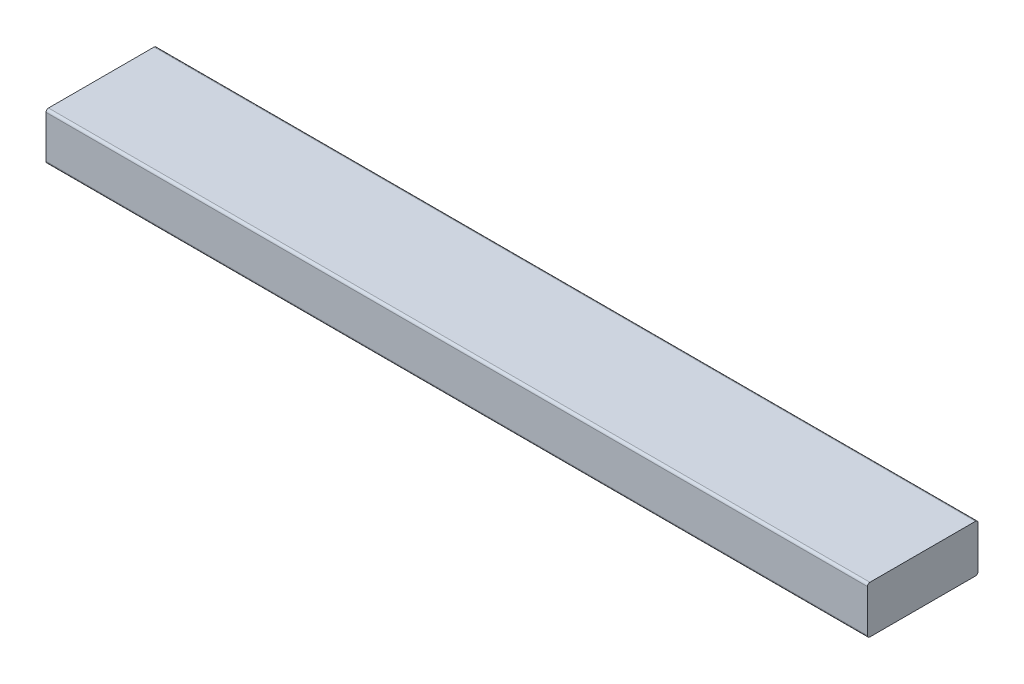
ISO-10303-21;
HEADER;
FILE_DESCRIPTION(('STEP AP214'),'2;1');
FILE_NAME('part.step','',(''),(''),'','','');
FILE_SCHEMA(('AUTOMOTIVE_DESIGN { 1 0 10303 214 1 1 1 1 }'));
ENDSEC;
DATA;
#1=APPLICATION_CONTEXT('core data for automotive mechanical design processes');
#2=APPLICATION_PROTOCOL_DEFINITION('international standard','automotive_design',2000,#1);
#3=PRODUCT_CONTEXT('',#1,'mechanical');
#4=PRODUCT('Part','Part','',(#3));
#5=PRODUCT_RELATED_PRODUCT_CATEGORY('part','',(#4));
#6=PRODUCT_DEFINITION_FORMATION('','',#4);
#7=PRODUCT_DEFINITION_CONTEXT('part definition',#1,'design');
#8=PRODUCT_DEFINITION('design','',#6,#7);
#9=PRODUCT_DEFINITION_SHAPE('','',#8);
#10=(LENGTH_UNIT() NAMED_UNIT(*) SI_UNIT(.MILLI.,.METRE.));
#11=(NAMED_UNIT(*) PLANE_ANGLE_UNIT() SI_UNIT($,.RADIAN.));
#12=(NAMED_UNIT(*) SI_UNIT($,.STERADIAN.) SOLID_ANGLE_UNIT());
#13=UNCERTAINTY_MEASURE_WITH_UNIT(LENGTH_MEASURE(1.E-05),#10,'distance_accuracy_value','');
#14=(GEOMETRIC_REPRESENTATION_CONTEXT(3) GLOBAL_UNCERTAINTY_ASSIGNED_CONTEXT((#13)) GLOBAL_UNIT_ASSIGNED_CONTEXT((#10,
#11,#12)) REPRESENTATION_CONTEXT('',''));
#15=CARTESIAN_POINT('',(0.,0.,0.));
#16=DIRECTION('',(0.,0.,1.));
#17=DIRECTION('',(1.,0.,0.));
#18=AXIS2_PLACEMENT_3D('',#15,#16,#17);
#19=CARTESIAN_POINT('',(660.4,-19.05,-44.45));
#20=DIRECTION('',(0.,0.,1.));
#21=DIRECTION('',(1.,0.,0.));
#22=AXIS2_PLACEMENT_3D('',#19,#20,#21);
#23=PLANE('',#22);
#24=DIRECTION('',(0.,1.,0.));
#25=VECTOR('',#24,1.);
#26=CARTESIAN_POINT('',(0.,-19.05,-44.45));
#27=LINE('',#26,#25);
#28=CARTESIAN_POINT('',(0.,-17.05,-44.45));
#29=VERTEX_POINT('',#28);
#30=CARTESIAN_POINT('',(0.,17.05,-44.45));
#31=VERTEX_POINT('',#30);
#32=EDGE_CURVE('E129',#29,#31,#27,.T.);
#33=ORIENTED_EDGE('',*,*,#32,.T.);
#34=DIRECTION('',(-1.,0.,0.));
#35=VECTOR('',#34,1.);
#36=CARTESIAN_POINT('',(660.4,17.05,-44.45));
#37=LINE('',#36,#35);
#38=CARTESIAN_POINT('',(660.4,17.05,-44.45));
#39=VERTEX_POINT('',#38);
#40=EDGE_CURVE('E152',#31,#39,#37,.F.);
#41=ORIENTED_EDGE('',*,*,#40,.T.);
#42=DIRECTION('',(0.,1.,0.));
#43=VECTOR('',#42,1.);
#44=CARTESIAN_POINT('',(660.4,-19.05,-44.45));
#45=LINE('',#44,#43);
#46=CARTESIAN_POINT('',(660.4,-17.05,-44.45));
#47=VERTEX_POINT('',#46);
#48=EDGE_CURVE('E127',#47,#39,#45,.T.);
#49=ORIENTED_EDGE('',*,*,#48,.F.);
#50=DIRECTION('',(-1.,0.,0.));
#51=VECTOR('',#50,1.);
#52=CARTESIAN_POINT('',(660.4,-17.05,-44.45));
#53=LINE('',#52,#51);
#54=EDGE_CURVE('E149',#47,#29,#53,.T.);
#55=ORIENTED_EDGE('',*,*,#54,.T.);
#56=EDGE_LOOP('',(#33,#41,#49,#55));
#57=FACE_BOUND('',#56,.T.);
#58=ADVANCED_FACE('F34',(#57),#23,.F.);
#59=CARTESIAN_POINT('',(660.4,19.05,44.45));
#60=DIRECTION('',(0.,-1.,0.));
#61=DIRECTION('',(0.,0.,-1.));
#62=AXIS2_PLACEMENT_3D('',#59,#60,#61);
#63=PLANE('',#62);
#64=DIRECTION('',(0.,0.,1.));
#65=VECTOR('',#64,1.);
#66=CARTESIAN_POINT('',(0.,19.05,44.45));
#67=LINE('',#66,#65);
#68=CARTESIAN_POINT('',(0.,19.05,-42.45));
#69=VERTEX_POINT('',#68);
#70=CARTESIAN_POINT('',(0.,19.05,42.45));
#71=VERTEX_POINT('',#70);
#72=EDGE_CURVE('E125',#69,#71,#67,.T.);
#73=ORIENTED_EDGE('',*,*,#72,.T.);
#74=DIRECTION('',(-1.,0.,0.));
#75=VECTOR('',#74,1.);
#76=CARTESIAN_POINT('',(660.4,19.05,42.45));
#77=LINE('',#76,#75);
#78=CARTESIAN_POINT('',(660.4,19.05,42.45));
#79=VERTEX_POINT('',#78);
#80=EDGE_CURVE('E104',#71,#79,#77,.F.);
#81=ORIENTED_EDGE('',*,*,#80,.T.);
#82=DIRECTION('',(0.,0.,1.));
#83=VECTOR('',#82,1.);
#84=CARTESIAN_POINT('',(660.4,19.05,44.45));
#85=LINE('',#84,#83);
#86=CARTESIAN_POINT('',(660.4,19.05,-42.45));
#87=VERTEX_POINT('',#86);
#88=EDGE_CURVE('E168',#87,#79,#85,.T.);
#89=ORIENTED_EDGE('',*,*,#88,.F.);
#90=DIRECTION('',(-1.,0.,0.));
#91=VECTOR('',#90,1.);
#92=CARTESIAN_POINT('',(660.4,19.05,-42.45));
#93=LINE('',#92,#91);
#94=EDGE_CURVE('E109',#87,#69,#93,.T.);
#95=ORIENTED_EDGE('',*,*,#94,.T.);
#96=EDGE_LOOP('',(#73,#81,#89,#95));
#97=FACE_BOUND('',#96,.T.);
#98=ADVANCED_FACE('F185',(#97),#63,.F.);
#99=CARTESIAN_POINT('',(660.4,-19.05,44.45));
#100=DIRECTION('',(0.,0.,-1.));
#101=DIRECTION('',(-1.,0.,0.));
#102=AXIS2_PLACEMENT_3D('',#99,#100,#101);
#103=PLANE('',#102);
#104=DIRECTION('',(0.,-1.,0.));
#105=VECTOR('',#104,1.);
#106=CARTESIAN_POINT('',(660.4,-19.05,44.45));
#107=LINE('',#106,#105);
#108=CARTESIAN_POINT('',(660.4,17.05,44.45));
#109=VERTEX_POINT('',#108);
#110=CARTESIAN_POINT('',(660.4,-17.05,44.45));
#111=VERTEX_POINT('',#110);
#112=EDGE_CURVE('E118',#109,#111,#107,.T.);
#113=ORIENTED_EDGE('',*,*,#112,.F.);
#114=DIRECTION('',(-1.,0.,0.));
#115=VECTOR('',#114,1.);
#116=CARTESIAN_POINT('',(660.4,17.05,44.45));
#117=LINE('',#116,#115);
#118=CARTESIAN_POINT('',(0.,17.05,44.45));
#119=VERTEX_POINT('',#118);
#120=EDGE_CURVE('E103',#109,#119,#117,.T.);
#121=ORIENTED_EDGE('',*,*,#120,.T.);
#122=DIRECTION('',(0.,-1.,0.));
#123=VECTOR('',#122,1.);
#124=CARTESIAN_POINT('',(0.,-19.05,44.45));
#125=LINE('',#124,#123);
#126=CARTESIAN_POINT('',(0.,-17.05,44.45));
#127=VERTEX_POINT('',#126);
#128=EDGE_CURVE('E116',#119,#127,#125,.T.);
#129=ORIENTED_EDGE('',*,*,#128,.T.);
#130=DIRECTION('',(-1.,0.,0.));
#131=VECTOR('',#130,1.);
#132=CARTESIAN_POINT('',(660.4,-17.05,44.45));
#133=LINE('',#132,#131);
#134=EDGE_CURVE('E120',#127,#111,#133,.F.);
#135=ORIENTED_EDGE('',*,*,#134,.T.);
#136=EDGE_LOOP('',(#113,#121,#129,#135));
#137=FACE_BOUND('',#136,.T.);
#138=ADVANCED_FACE('F115',(#137),#103,.F.);
#139=CARTESIAN_POINT('',(660.4,-19.05,44.45));
#140=DIRECTION('',(0.,1.,0.));
#141=DIRECTION('',(0.,0.,1.));
#142=AXIS2_PLACEMENT_3D('',#139,#140,#141);
#143=PLANE('',#142);
#144=DIRECTION('',(0.,0.,-1.));
#145=VECTOR('',#144,1.);
#146=CARTESIAN_POINT('',(0.,-19.05,44.45));
#147=LINE('',#146,#145);
#148=CARTESIAN_POINT('',(0.,-19.05,42.45));
#149=VERTEX_POINT('',#148);
#150=CARTESIAN_POINT('',(0.,-19.05,-42.45));
#151=VERTEX_POINT('',#150);
#152=EDGE_CURVE('E124',#149,#151,#147,.T.);
#153=ORIENTED_EDGE('',*,*,#152,.T.);
#154=DIRECTION('',(-1.,0.,0.));
#155=VECTOR('',#154,1.);
#156=CARTESIAN_POINT('',(660.4,-19.05,-42.45));
#157=LINE('',#156,#155);
#158=CARTESIAN_POINT('',(660.4,-19.05,-42.45));
#159=VERTEX_POINT('',#158);
#160=EDGE_CURVE('E11',#151,#159,#157,.F.);
#161=ORIENTED_EDGE('',*,*,#160,.T.);
#162=DIRECTION('',(0.,0.,-1.));
#163=VECTOR('',#162,1.);
#164=CARTESIAN_POINT('',(660.4,-19.05,44.45));
#165=LINE('',#164,#163);
#166=CARTESIAN_POINT('',(660.4,-19.05,42.45));
#167=VERTEX_POINT('',#166);
#168=EDGE_CURVE('E133',#167,#159,#165,.T.);
#169=ORIENTED_EDGE('',*,*,#168,.F.);
#170=DIRECTION('',(-1.,0.,0.));
#171=VECTOR('',#170,1.);
#172=CARTESIAN_POINT('',(660.4,-19.05,42.45));
#173=LINE('',#172,#171);
#174=EDGE_CURVE('E42',#167,#149,#173,.T.);
#175=ORIENTED_EDGE('',*,*,#174,.T.);
#176=EDGE_LOOP('',(#153,#161,#169,#175));
#177=FACE_BOUND('',#176,.T.);
#178=ADVANCED_FACE('F155',(#177),#143,.F.);
#179=CARTESIAN_POINT('',(660.4,0.,0.));
#180=DIRECTION('',(-1.,0.,0.));
#181=DIRECTION('',(0.,0.,1.));
#182=AXIS2_PLACEMENT_3D('',#179,#180,#181);
#183=PLANE('',#182);
#184=ORIENTED_EDGE('',*,*,#88,.T.);
#185=CARTESIAN_POINT('',(660.4,17.05,42.45));
#186=DIRECTION('',(-1.,0.,0.));
#187=DIRECTION('',(0.,0.,1.));
#188=AXIS2_PLACEMENT_3D('',#185,#186,#187);
#189=CIRCLE('',#188,2.);
#190=EDGE_CURVE('E147',#79,#109,#189,.F.);
#191=ORIENTED_EDGE('',*,*,#190,.T.);
#192=ORIENTED_EDGE('',*,*,#112,.T.);
#193=CARTESIAN_POINT('',(660.4,-17.05,42.45));
#194=DIRECTION('',(-1.,0.,0.));
#195=DIRECTION('',(0.,0.,1.));
#196=AXIS2_PLACEMENT_3D('',#193,#194,#195);
#197=CIRCLE('',#196,2.);
#198=EDGE_CURVE('E54',#111,#167,#197,.F.);
#199=ORIENTED_EDGE('',*,*,#198,.T.);
#200=ORIENTED_EDGE('',*,*,#168,.T.);
#201=CARTESIAN_POINT('',(660.4,-17.05,-42.45));
#202=DIRECTION('',(-1.,0.,0.));
#203=DIRECTION('',(0.,0.,1.));
#204=AXIS2_PLACEMENT_3D('',#201,#202,#203);
#205=CIRCLE('',#204,2.);
#206=EDGE_CURVE('E143',#159,#47,#205,.F.);
#207=ORIENTED_EDGE('',*,*,#206,.T.);
#208=ORIENTED_EDGE('',*,*,#48,.T.);
#209=CARTESIAN_POINT('',(660.4,17.05,-42.45));
#210=DIRECTION('',(-1.,0.,0.));
#211=DIRECTION('',(0.,0.,1.));
#212=AXIS2_PLACEMENT_3D('',#209,#210,#211);
#213=CIRCLE('',#212,2.);
#214=EDGE_CURVE('E145',#39,#87,#213,.F.);
#215=ORIENTED_EDGE('',*,*,#214,.T.);
#216=EDGE_LOOP('',(#184,#191,#192,#199,#200,#207,#208,#215));
#217=FACE_BOUND('',#216,.T.);
#218=ADVANCED_FACE('F174',(#217),#183,.F.);
#219=CARTESIAN_POINT('',(0.,0.,0.));
#220=DIRECTION('',(-1.,0.,0.));
#221=DIRECTION('',(0.,0.,1.));
#222=AXIS2_PLACEMENT_3D('',#219,#220,#221);
#223=PLANE('',#222);
#224=ORIENTED_EDGE('',*,*,#128,.F.);
#225=CARTESIAN_POINT('',(0.,17.05,42.45));
#226=DIRECTION('',(-1.,0.,0.));
#227=DIRECTION('',(0.,0.,1.));
#228=AXIS2_PLACEMENT_3D('',#225,#226,#227);
#229=CIRCLE('',#228,2.);
#230=EDGE_CURVE('E99',#119,#71,#229,.T.);
#231=ORIENTED_EDGE('',*,*,#230,.T.);
#232=ORIENTED_EDGE('',*,*,#72,.F.);
#233=CARTESIAN_POINT('',(0.,17.05,-42.45));
#234=DIRECTION('',(-1.,0.,0.));
#235=DIRECTION('',(0.,0.,1.));
#236=AXIS2_PLACEMENT_3D('',#233,#234,#235);
#237=CIRCLE('',#236,2.);
#238=EDGE_CURVE('E110',#69,#31,#237,.T.);
#239=ORIENTED_EDGE('',*,*,#238,.T.);
#240=ORIENTED_EDGE('',*,*,#32,.F.);
#241=CARTESIAN_POINT('',(0.,-17.05,-42.45));
#242=DIRECTION('',(-1.,0.,0.));
#243=DIRECTION('',(0.,0.,1.));
#244=AXIS2_PLACEMENT_3D('',#241,#242,#243);
#245=CIRCLE('',#244,2.);
#246=EDGE_CURVE('E136',#29,#151,#245,.T.);
#247=ORIENTED_EDGE('',*,*,#246,.T.);
#248=ORIENTED_EDGE('',*,*,#152,.F.);
#249=CARTESIAN_POINT('',(0.,-17.05,42.45));
#250=DIRECTION('',(-1.,0.,0.));
#251=DIRECTION('',(0.,0.,1.));
#252=AXIS2_PLACEMENT_3D('',#249,#250,#251);
#253=CIRCLE('',#252,2.);
#254=EDGE_CURVE('E119',#149,#127,#253,.T.);
#255=ORIENTED_EDGE('',*,*,#254,.T.);
#256=EDGE_LOOP('',(#224,#231,#232,#239,#240,#247,#248,#255));
#257=FACE_BOUND('',#256,.T.);
#258=ADVANCED_FACE('F122',(#257),#223,.T.);
#259=CARTESIAN_POINT('',(660.4,17.05,42.45));
#260=DIRECTION('',(-1.,0.,0.));
#261=DIRECTION('',(0.,0.,1.));
#262=AXIS2_PLACEMENT_3D('',#259,#260,#261);
#263=CYLINDRICAL_SURFACE('',#262,2.);
#264=ORIENTED_EDGE('',*,*,#190,.F.);
#265=ORIENTED_EDGE('',*,*,#80,.F.);
#266=ORIENTED_EDGE('',*,*,#230,.F.);
#267=ORIENTED_EDGE('',*,*,#120,.F.);
#268=EDGE_LOOP('',(#264,#265,#266,#267));
#269=FACE_BOUND('',#268,.T.);
#270=ADVANCED_FACE('F102',(#269),#263,.T.);
#271=CARTESIAN_POINT('',(660.4,17.05,-42.45));
#272=DIRECTION('',(-1.,0.,0.));
#273=DIRECTION('',(0.,0.,1.));
#274=AXIS2_PLACEMENT_3D('',#271,#272,#273);
#275=CYLINDRICAL_SURFACE('',#274,2.);
#276=ORIENTED_EDGE('',*,*,#214,.F.);
#277=ORIENTED_EDGE('',*,*,#40,.F.);
#278=ORIENTED_EDGE('',*,*,#238,.F.);
#279=ORIENTED_EDGE('',*,*,#94,.F.);
#280=EDGE_LOOP('',(#276,#277,#278,#279));
#281=FACE_BOUND('',#280,.T.);
#282=ADVANCED_FACE('F196',(#281),#275,.T.);
#283=CARTESIAN_POINT('',(660.4,-17.05,-42.45));
#284=DIRECTION('',(-1.,0.,0.));
#285=DIRECTION('',(0.,0.,1.));
#286=AXIS2_PLACEMENT_3D('',#283,#284,#285);
#287=CYLINDRICAL_SURFACE('',#286,2.);
#288=ORIENTED_EDGE('',*,*,#206,.F.);
#289=ORIENTED_EDGE('',*,*,#160,.F.);
#290=ORIENTED_EDGE('',*,*,#246,.F.);
#291=ORIENTED_EDGE('',*,*,#54,.F.);
#292=EDGE_LOOP('',(#288,#289,#290,#291));
#293=FACE_BOUND('',#292,.T.);
#294=ADVANCED_FACE('F162',(#293),#287,.T.);
#295=CARTESIAN_POINT('',(660.4,-17.05,42.45));
#296=DIRECTION('',(-1.,0.,0.));
#297=DIRECTION('',(0.,0.,1.));
#298=AXIS2_PLACEMENT_3D('',#295,#296,#297);
#299=CYLINDRICAL_SURFACE('',#298,2.);
#300=ORIENTED_EDGE('',*,*,#198,.F.);
#301=ORIENTED_EDGE('',*,*,#134,.F.);
#302=ORIENTED_EDGE('',*,*,#254,.F.);
#303=ORIENTED_EDGE('',*,*,#174,.F.);
#304=EDGE_LOOP('',(#300,#301,#302,#303));
#305=FACE_BOUND('',#304,.T.);
#306=ADVANCED_FACE('F36',(#305),#299,.T.);
#307=CLOSED_SHELL('',(#58,#98,#138,#178,#218,#258,#270,#282,#294,#306));
#308=MANIFOLD_SOLID_BREP('B2',#307);
#309=ADVANCED_BREP_SHAPE_REPRESENTATION('',(#18,#308),#14);
#310=SHAPE_DEFINITION_REPRESENTATION(#9,#309);
ENDSEC;
END-ISO-10303-21;
